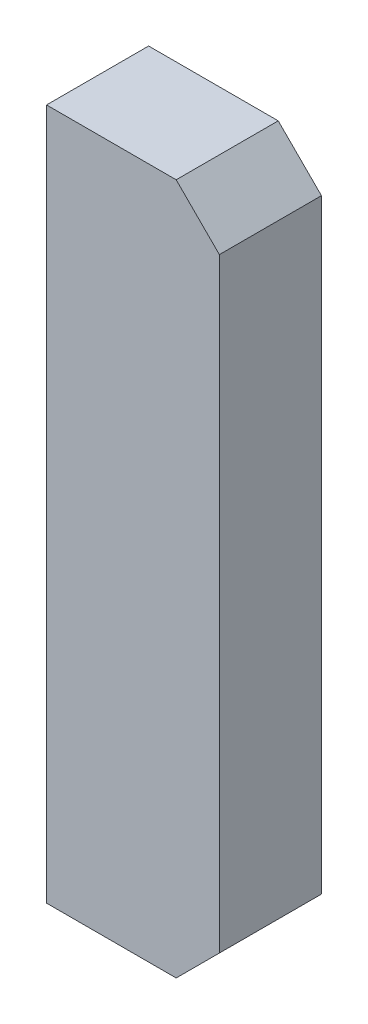
ISO-10303-21;
HEADER;
FILE_DESCRIPTION(('STEP AP214'),'2;1');
FILE_NAME('part.step','',(''),(''),'','','');
FILE_SCHEMA(('AUTOMOTIVE_DESIGN { 1 0 10303 214 1 1 1 1 }'));
ENDSEC;
DATA;
#1=APPLICATION_CONTEXT('core data for automotive mechanical design processes');
#2=APPLICATION_PROTOCOL_DEFINITION('international standard','automotive_design',2000,#1);
#3=PRODUCT_CONTEXT('',#1,'mechanical');
#4=PRODUCT('Part','Part','',(#3));
#5=PRODUCT_RELATED_PRODUCT_CATEGORY('part','',(#4));
#6=PRODUCT_DEFINITION_FORMATION('','',#4);
#7=PRODUCT_DEFINITION_CONTEXT('part definition',#1,'design');
#8=PRODUCT_DEFINITION('design','',#6,#7);
#9=PRODUCT_DEFINITION_SHAPE('','',#8);
#10=(LENGTH_UNIT() NAMED_UNIT(*) SI_UNIT(.MILLI.,.METRE.));
#11=(NAMED_UNIT(*) PLANE_ANGLE_UNIT() SI_UNIT($,.RADIAN.));
#12=(NAMED_UNIT(*) SI_UNIT($,.STERADIAN.) SOLID_ANGLE_UNIT());
#13=UNCERTAINTY_MEASURE_WITH_UNIT(LENGTH_MEASURE(1.E-05),#10,'distance_accuracy_value','');
#14=(GEOMETRIC_REPRESENTATION_CONTEXT(3) GLOBAL_UNCERTAINTY_ASSIGNED_CONTEXT((#13)) GLOBAL_UNIT_ASSIGNED_CONTEXT((#10,
#11,#12)) REPRESENTATION_CONTEXT('',''));
#15=CARTESIAN_POINT('',(0.,0.,0.));
#16=DIRECTION('',(0.,0.,1.));
#17=DIRECTION('',(1.,0.,0.));
#18=AXIS2_PLACEMENT_3D('',#15,#16,#17);
#19=CARTESIAN_POINT('',(1.27,19.05,5.));
#20=DIRECTION('',(0.,0.,-1.));
#21=DIRECTION('',(-1.,0.,0.));
#22=AXIS2_PLACEMENT_3D('',#19,#20,#21);
#23=PLANE('',#22);
#24=DIRECTION('',(0.,1.,0.));
#25=VECTOR('',#24,1.);
#26=CARTESIAN_POINT('',(-2.54,19.05,5.));
#27=LINE('',#26,#25);
#28=CARTESIAN_POINT('',(-2.54,19.05,5.));
#29=VERTEX_POINT('',#28);
#30=CARTESIAN_POINT('',(-2.54,-1.27,5.));
#31=VERTEX_POINT('',#30);
#32=EDGE_CURVE('E95',#29,#31,#27,.F.);
#33=ORIENTED_EDGE('',*,*,#32,.T.);
#34=DIRECTION('',(1.,0.,0.));
#35=VECTOR('',#34,1.);
#36=CARTESIAN_POINT('',(-2.54,-1.27,5.));
#37=LINE('',#36,#35);
#38=CARTESIAN_POINT('',(1.27,-1.27,5.));
#39=VERTEX_POINT('',#38);
#40=EDGE_CURVE('E91',#31,#39,#37,.T.);
#41=ORIENTED_EDGE('',*,*,#40,.T.);
#42=DIRECTION('',(-0.707106781186548,-0.707106781186548,0.));
#43=VECTOR('',#42,1.);
#44=CARTESIAN_POINT('',(1.27,-1.27,5.));
#45=LINE('',#44,#43);
#46=CARTESIAN_POINT('',(2.54,0.,5.));
#47=VERTEX_POINT('',#46);
#48=EDGE_CURVE('E67',#39,#47,#45,.F.);
#49=ORIENTED_EDGE('',*,*,#48,.T.);
#50=DIRECTION('',(0.,1.,0.));
#51=VECTOR('',#50,1.);
#52=CARTESIAN_POINT('',(2.54,0.,5.));
#53=LINE('',#52,#51);
#54=CARTESIAN_POINT('',(2.54,17.78,5.));
#55=VERTEX_POINT('',#54);
#56=EDGE_CURVE('E69',#47,#55,#53,.T.);
#57=ORIENTED_EDGE('',*,*,#56,.T.);
#58=DIRECTION('',(0.707106781186548,-0.707106781186548,0.));
#59=VECTOR('',#58,1.);
#60=CARTESIAN_POINT('',(2.54,17.78,5.));
#61=LINE('',#60,#59);
#62=CARTESIAN_POINT('',(1.27,19.05,5.));
#63=VERTEX_POINT('',#62);
#64=EDGE_CURVE('E19',#55,#63,#61,.F.);
#65=ORIENTED_EDGE('',*,*,#64,.T.);
#66=DIRECTION('',(1.,0.,0.));
#67=VECTOR('',#66,1.);
#68=CARTESIAN_POINT('',(1.27,19.05,5.));
#69=LINE('',#68,#67);
#70=EDGE_CURVE('E100',#63,#29,#69,.F.);
#71=ORIENTED_EDGE('',*,*,#70,.T.);
#72=EDGE_LOOP('',(#33,#41,#49,#57,#65,#71));
#73=FACE_BOUND('',#72,.T.);
#74=ADVANCED_FACE('F16',(#73),#23,.F.);
#75=CARTESIAN_POINT('',(2.54,17.78,2.));
#76=DIRECTION('',(-0.707106781186548,-0.707106781186548,0.));
#77=DIRECTION('',(0.707106781186548,-0.707106781186548,0.));
#78=AXIS2_PLACEMENT_3D('',#75,#76,#77);
#79=PLANE('',#78);
#80=DIRECTION('',(0.,0.,-1.));
#81=VECTOR('',#80,1.);
#82=CARTESIAN_POINT('',(1.27,19.05,2.));
#83=LINE('',#82,#81);
#84=CARTESIAN_POINT('',(1.27,19.05,2.));
#85=VERTEX_POINT('',#84);
#86=EDGE_CURVE('E80',#85,#63,#83,.F.);
#87=ORIENTED_EDGE('',*,*,#86,.T.);
#88=ORIENTED_EDGE('',*,*,#64,.F.);
#89=DIRECTION('',(0.,0.,1.));
#90=VECTOR('',#89,1.);
#91=CARTESIAN_POINT('',(2.54,17.78,2.));
#92=LINE('',#91,#90);
#93=CARTESIAN_POINT('',(2.54,17.78,2.));
#94=VERTEX_POINT('',#93);
#95=EDGE_CURVE('E75',#55,#94,#92,.F.);
#96=ORIENTED_EDGE('',*,*,#95,.T.);
#97=DIRECTION('',(0.707106781186547,-0.707106781186548,0.));
#98=VECTOR('',#97,1.);
#99=CARTESIAN_POINT('',(1.27,19.05,2.));
#100=LINE('',#99,#98);
#101=EDGE_CURVE('E103',#85,#94,#100,.T.);
#102=ORIENTED_EDGE('',*,*,#101,.F.);
#103=EDGE_LOOP('',(#87,#88,#96,#102));
#104=FACE_BOUND('',#103,.T.);
#105=ADVANCED_FACE('F77',(#104),#79,.F.);
#106=CARTESIAN_POINT('',(2.54,0.,2.));
#107=DIRECTION('',(-1.,0.,0.));
#108=DIRECTION('',(0.,0.,1.));
#109=AXIS2_PLACEMENT_3D('',#106,#107,#108);
#110=PLANE('',#109);
#111=ORIENTED_EDGE('',*,*,#95,.F.);
#112=ORIENTED_EDGE('',*,*,#56,.F.);
#113=DIRECTION('',(0.,0.,1.));
#114=VECTOR('',#113,1.);
#115=CARTESIAN_POINT('',(2.54,0.,2.));
#116=LINE('',#115,#114);
#117=CARTESIAN_POINT('',(2.54,0.,2.));
#118=VERTEX_POINT('',#117);
#119=EDGE_CURVE('E87',#47,#118,#116,.F.);
#120=ORIENTED_EDGE('',*,*,#119,.T.);
#121=DIRECTION('',(0.,1.,0.));
#122=VECTOR('',#121,1.);
#123=CARTESIAN_POINT('',(2.54,19.05,2.));
#124=LINE('',#123,#122);
#125=EDGE_CURVE('E84',#94,#118,#124,.F.);
#126=ORIENTED_EDGE('',*,*,#125,.F.);
#127=EDGE_LOOP('',(#111,#112,#120,#126));
#128=FACE_BOUND('',#127,.T.);
#129=ADVANCED_FACE('F82',(#128),#110,.F.);
#130=CARTESIAN_POINT('',(1.27,-1.27,2.));
#131=DIRECTION('',(-0.707106781186548,0.707106781186548,0.));
#132=DIRECTION('',(-0.707106781186548,-0.707106781186548,0.));
#133=AXIS2_PLACEMENT_3D('',#130,#131,#132);
#134=PLANE('',#133);
#135=ORIENTED_EDGE('',*,*,#119,.F.);
#136=ORIENTED_EDGE('',*,*,#48,.F.);
#137=DIRECTION('',(0.,0.,1.));
#138=VECTOR('',#137,1.);
#139=CARTESIAN_POINT('',(1.27,-1.27,2.));
#140=LINE('',#139,#138);
#141=CARTESIAN_POINT('',(1.27,-1.27,2.));
#142=VERTEX_POINT('',#141);
#143=EDGE_CURVE('E93',#39,#142,#140,.F.);
#144=ORIENTED_EDGE('',*,*,#143,.T.);
#145=DIRECTION('',(-0.707106781186547,-0.707106781186548,0.));
#146=VECTOR('',#145,1.);
#147=CARTESIAN_POINT('',(2.54,0.,2.));
#148=LINE('',#147,#146);
#149=EDGE_CURVE('E106',#118,#142,#148,.T.);
#150=ORIENTED_EDGE('',*,*,#149,.F.);
#151=EDGE_LOOP('',(#135,#136,#144,#150));
#152=FACE_BOUND('',#151,.T.);
#153=ADVANCED_FACE('F123',(#152),#134,.F.);
#154=CARTESIAN_POINT('',(-2.54,-1.27,2.));
#155=DIRECTION('',(0.,1.,0.));
#156=DIRECTION('',(0.,0.,1.));
#157=AXIS2_PLACEMENT_3D('',#154,#155,#156);
#158=PLANE('',#157);
#159=ORIENTED_EDGE('',*,*,#143,.F.);
#160=ORIENTED_EDGE('',*,*,#40,.F.);
#161=DIRECTION('',(0.,0.,-1.));
#162=VECTOR('',#161,1.);
#163=CARTESIAN_POINT('',(-2.54,-1.27,2.));
#164=LINE('',#163,#162);
#165=CARTESIAN_POINT('',(-2.54,-1.27,2.));
#166=VERTEX_POINT('',#165);
#167=EDGE_CURVE('E97',#31,#166,#164,.T.);
#168=ORIENTED_EDGE('',*,*,#167,.T.);
#169=DIRECTION('',(-1.,0.,0.));
#170=VECTOR('',#169,1.);
#171=CARTESIAN_POINT('',(1.27,-1.27,2.));
#172=LINE('',#171,#170);
#173=EDGE_CURVE('E109',#142,#166,#172,.T.);
#174=ORIENTED_EDGE('',*,*,#173,.F.);
#175=EDGE_LOOP('',(#159,#160,#168,#174));
#176=FACE_BOUND('',#175,.T.);
#177=ADVANCED_FACE('F121',(#176),#158,.F.);
#178=CARTESIAN_POINT('',(-2.54,19.05,2.));
#179=DIRECTION('',(1.,0.,0.));
#180=DIRECTION('',(0.,0.,-1.));
#181=AXIS2_PLACEMENT_3D('',#178,#179,#180);
#182=PLANE('',#181);
#183=ORIENTED_EDGE('',*,*,#167,.F.);
#184=ORIENTED_EDGE('',*,*,#32,.F.);
#185=DIRECTION('',(0.,0.,-1.));
#186=VECTOR('',#185,1.);
#187=CARTESIAN_POINT('',(-2.54,19.05,2.));
#188=LINE('',#187,#186);
#189=CARTESIAN_POINT('',(-2.54,19.05,2.));
#190=VERTEX_POINT('',#189);
#191=EDGE_CURVE('E34',#29,#190,#188,.T.);
#192=ORIENTED_EDGE('',*,*,#191,.T.);
#193=DIRECTION('',(0.,1.,0.));
#194=VECTOR('',#193,1.);
#195=CARTESIAN_POINT('',(-2.54,19.05,2.));
#196=LINE('',#195,#194);
#197=EDGE_CURVE('E25',#166,#190,#196,.T.);
#198=ORIENTED_EDGE('',*,*,#197,.F.);
#199=EDGE_LOOP('',(#183,#184,#192,#198));
#200=FACE_BOUND('',#199,.T.);
#201=ADVANCED_FACE('F117',(#200),#182,.F.);
#202=CARTESIAN_POINT('',(1.27,19.05,2.));
#203=DIRECTION('',(0.,-1.,0.));
#204=DIRECTION('',(0.,0.,-1.));
#205=AXIS2_PLACEMENT_3D('',#202,#203,#204);
#206=PLANE('',#205);
#207=ORIENTED_EDGE('',*,*,#191,.F.);
#208=ORIENTED_EDGE('',*,*,#70,.F.);
#209=ORIENTED_EDGE('',*,*,#86,.F.);
#210=DIRECTION('',(-1.,0.,0.));
#211=VECTOR('',#210,1.);
#212=CARTESIAN_POINT('',(1.27,19.05,2.));
#213=LINE('',#212,#211);
#214=EDGE_CURVE('E11',#190,#85,#213,.F.);
#215=ORIENTED_EDGE('',*,*,#214,.F.);
#216=EDGE_LOOP('',(#207,#208,#209,#215));
#217=FACE_BOUND('',#216,.T.);
#218=ADVANCED_FACE('F126',(#217),#206,.F.);
#219=CARTESIAN_POINT('',(1.27,19.05,2.));
#220=DIRECTION('',(0.,0.,-1.));
#221=DIRECTION('',(-1.,0.,0.));
#222=AXIS2_PLACEMENT_3D('',#219,#220,#221);
#223=PLANE('',#222);
#224=ORIENTED_EDGE('',*,*,#197,.T.);
#225=ORIENTED_EDGE('',*,*,#214,.T.);
#226=ORIENTED_EDGE('',*,*,#101,.T.);
#227=ORIENTED_EDGE('',*,*,#125,.T.);
#228=ORIENTED_EDGE('',*,*,#149,.T.);
#229=ORIENTED_EDGE('',*,*,#173,.T.);
#230=EDGE_LOOP('',(#224,#225,#226,#227,#228,#229));
#231=FACE_BOUND('',#230,.T.);
#232=ADVANCED_FACE('F114',(#231),#223,.T.);
#233=CLOSED_SHELL('',(#74,#105,#129,#153,#177,#201,#218,#232));
#234=MANIFOLD_SOLID_BREP('B1',#233);
#235=ADVANCED_BREP_SHAPE_REPRESENTATION('',(#18,#234),#14);
#236=SHAPE_DEFINITION_REPRESENTATION(#9,#235);
ENDSEC;
END-ISO-10303-21;
